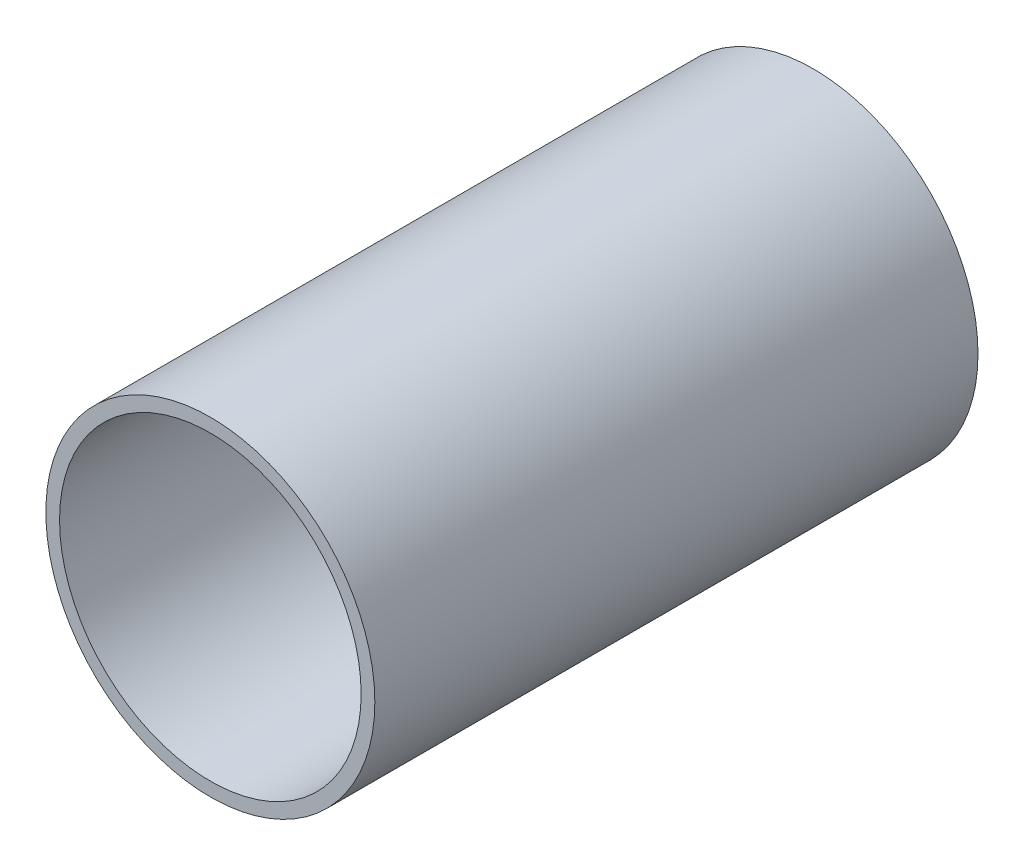
ISO-10303-21;
HEADER;
FILE_DESCRIPTION(('STEP AP214'),'2;1');
FILE_NAME('part.step','',(''),(''),'','','');
FILE_SCHEMA(('AUTOMOTIVE_DESIGN { 1 0 10303 214 1 1 1 1 }'));
ENDSEC;
DATA;
#1=APPLICATION_CONTEXT('core data for automotive mechanical design processes');
#2=APPLICATION_PROTOCOL_DEFINITION('international standard','automotive_design',2000,#1);
#3=PRODUCT_CONTEXT('',#1,'mechanical');
#4=PRODUCT('Part','Part','',(#3));
#5=PRODUCT_RELATED_PRODUCT_CATEGORY('part','',(#4));
#6=PRODUCT_DEFINITION_FORMATION('','',#4);
#7=PRODUCT_DEFINITION_CONTEXT('part definition',#1,'design');
#8=PRODUCT_DEFINITION('design','',#6,#7);
#9=PRODUCT_DEFINITION_SHAPE('','',#8);
#10=(LENGTH_UNIT() NAMED_UNIT(*) SI_UNIT(.MILLI.,.METRE.));
#11=(NAMED_UNIT(*) PLANE_ANGLE_UNIT() SI_UNIT($,.RADIAN.));
#12=(NAMED_UNIT(*) SI_UNIT($,.STERADIAN.) SOLID_ANGLE_UNIT());
#13=UNCERTAINTY_MEASURE_WITH_UNIT(LENGTH_MEASURE(1.E-05),#10,'distance_accuracy_value','');
#14=(GEOMETRIC_REPRESENTATION_CONTEXT(3) GLOBAL_UNCERTAINTY_ASSIGNED_CONTEXT((#13)) GLOBAL_UNIT_ASSIGNED_CONTEXT((#10,
#11,#12)) REPRESENTATION_CONTEXT('',''));
#15=CARTESIAN_POINT('',(0.,0.,0.));
#16=DIRECTION('',(0.,0.,1.));
#17=DIRECTION('',(1.,0.,0.));
#18=AXIS2_PLACEMENT_3D('',#15,#16,#17);
#19=CARTESIAN_POINT('',(0.,0.,139.7));
#20=DIRECTION('',(0.,0.,1.));
#21=DIRECTION('',(1.,0.,0.));
#22=AXIS2_PLACEMENT_3D('',#19,#20,#21);
#23=PLANE('',#22);
#24=CARTESIAN_POINT('',(0.,0.,139.7));
#25=DIRECTION('',(0.,0.,1.));
#26=DIRECTION('',(1.,0.,0.));
#27=AXIS2_PLACEMENT_3D('',#24,#25,#26);
#28=CIRCLE('',#27,38.1);
#29=CARTESIAN_POINT('',(38.1,0.,139.7));
#30=VERTEX_POINT('',#29);
#31=EDGE_CURVE('E10',#30,#30,#28,.T.);
#32=ORIENTED_EDGE('',*,*,#31,.T.);
#33=EDGE_LOOP('',(#32));
#34=FACE_BOUND('',#33,.T.);
#35=CARTESIAN_POINT('',(0.,0.,139.7));
#36=DIRECTION('',(0.,0.,1.));
#37=DIRECTION('',(1.,0.,0.));
#38=AXIS2_PLACEMENT_3D('',#35,#36,#37);
#39=CIRCLE('',#38,34.925);
#40=CARTESIAN_POINT('',(34.925,0.,139.7));
#41=VERTEX_POINT('',#40);
#42=EDGE_CURVE('E42',#41,#41,#39,.T.);
#43=ORIENTED_EDGE('',*,*,#42,.F.);
#44=EDGE_LOOP('',(#43));
#45=FACE_BOUND('',#44,.T.);
#46=ADVANCED_FACE('F31',(#34,#45),#23,.T.);
#47=CARTESIAN_POINT('',(0.,0.,0.));
#48=DIRECTION('',(0.,0.,1.));
#49=DIRECTION('',(1.,0.,0.));
#50=AXIS2_PLACEMENT_3D('',#47,#48,#49);
#51=PLANE('',#50);
#52=CARTESIAN_POINT('',(0.,0.,0.));
#53=DIRECTION('',(0.,0.,1.));
#54=DIRECTION('',(1.,0.,0.));
#55=AXIS2_PLACEMENT_3D('',#52,#53,#54);
#56=CIRCLE('',#55,38.1);
#57=CARTESIAN_POINT('',(38.1,0.,0.));
#58=VERTEX_POINT('',#57);
#59=EDGE_CURVE('E35',#58,#58,#56,.T.);
#60=ORIENTED_EDGE('',*,*,#59,.F.);
#61=EDGE_LOOP('',(#60));
#62=FACE_BOUND('',#61,.T.);
#63=CARTESIAN_POINT('',(0.,0.,0.));
#64=DIRECTION('',(0.,0.,1.));
#65=DIRECTION('',(1.,0.,0.));
#66=AXIS2_PLACEMENT_3D('',#63,#64,#65);
#67=CIRCLE('',#66,34.925);
#68=CARTESIAN_POINT('',(34.925,0.,0.));
#69=VERTEX_POINT('',#68);
#70=EDGE_CURVE('E44',#69,#69,#67,.T.);
#71=ORIENTED_EDGE('',*,*,#70,.T.);
#72=EDGE_LOOP('',(#71));
#73=FACE_BOUND('',#72,.T.);
#74=ADVANCED_FACE('F54',(#62,#73),#51,.F.);
#75=CARTESIAN_POINT('',(0.,0.,139.7));
#76=DIRECTION('',(0.,0.,-1.));
#77=DIRECTION('',(-1.,0.,0.));
#78=AXIS2_PLACEMENT_3D('',#75,#76,#77);
#79=CYLINDRICAL_SURFACE('',#78,38.1);
#80=ORIENTED_EDGE('',*,*,#31,.F.);
#81=EDGE_LOOP('',(#80));
#82=FACE_BOUND('',#81,.T.);
#83=ORIENTED_EDGE('',*,*,#59,.T.);
#84=EDGE_LOOP('',(#83));
#85=FACE_BOUND('',#84,.T.);
#86=ADVANCED_FACE('F33',(#82,#85),#79,.T.);
#87=CARTESIAN_POINT('',(0.,0.,139.7));
#88=DIRECTION('',(0.,0.,-1.));
#89=DIRECTION('',(-1.,0.,0.));
#90=AXIS2_PLACEMENT_3D('',#87,#88,#89);
#91=CYLINDRICAL_SURFACE('',#90,34.925);
#92=ORIENTED_EDGE('',*,*,#42,.T.);
#93=EDGE_LOOP('',(#92));
#94=FACE_BOUND('',#93,.T.);
#95=ORIENTED_EDGE('',*,*,#70,.F.);
#96=EDGE_LOOP('',(#95));
#97=FACE_BOUND('',#96,.T.);
#98=ADVANCED_FACE('F50',(#94,#97),#91,.F.);
#99=CLOSED_SHELL('',(#46,#74,#86,#98));
#100=MANIFOLD_SOLID_BREP('B2',#99);
#101=ADVANCED_BREP_SHAPE_REPRESENTATION('',(#18,#100),#14);
#102=SHAPE_DEFINITION_REPRESENTATION(#9,#101);
ENDSEC;
END-ISO-10303-21;
